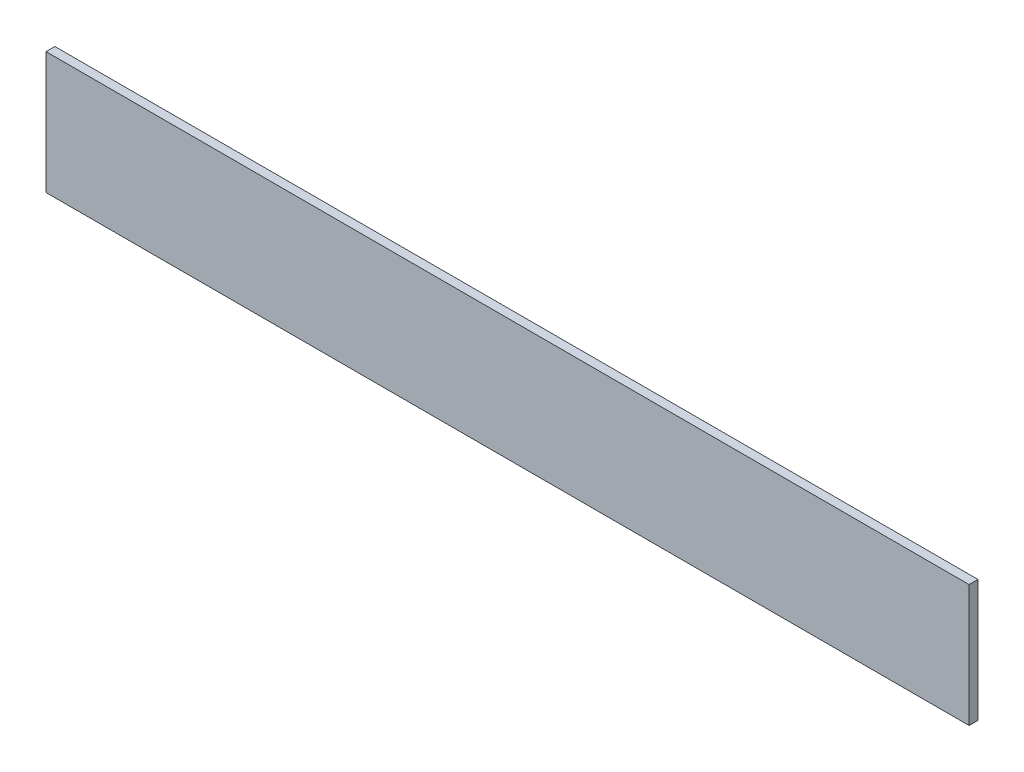
ISO-10303-21;
HEADER;
FILE_DESCRIPTION(('STEP AP214'),'2;1');
FILE_NAME('part.step','',(''),(''),'','','');
FILE_SCHEMA(('AUTOMOTIVE_DESIGN { 1 0 10303 214 1 1 1 1 }'));
ENDSEC;
DATA;
#1=APPLICATION_CONTEXT('core data for automotive mechanical design processes');
#2=APPLICATION_PROTOCOL_DEFINITION('international standard','automotive_design',2000,#1);
#3=PRODUCT_CONTEXT('',#1,'mechanical');
#4=PRODUCT('Part','Part','',(#3));
#5=PRODUCT_RELATED_PRODUCT_CATEGORY('part','',(#4));
#6=PRODUCT_DEFINITION_FORMATION('','',#4);
#7=PRODUCT_DEFINITION_CONTEXT('part definition',#1,'design');
#8=PRODUCT_DEFINITION('design','',#6,#7);
#9=PRODUCT_DEFINITION_SHAPE('','',#8);
#10=(LENGTH_UNIT() NAMED_UNIT(*) SI_UNIT(.MILLI.,.METRE.));
#11=(NAMED_UNIT(*) PLANE_ANGLE_UNIT() SI_UNIT($,.RADIAN.));
#12=(NAMED_UNIT(*) SI_UNIT($,.STERADIAN.) SOLID_ANGLE_UNIT());
#13=UNCERTAINTY_MEASURE_WITH_UNIT(LENGTH_MEASURE(1.E-05),#10,'distance_accuracy_value','');
#14=(GEOMETRIC_REPRESENTATION_CONTEXT(3) GLOBAL_UNCERTAINTY_ASSIGNED_CONTEXT((#13)) GLOBAL_UNIT_ASSIGNED_CONTEXT((#10,
#11,#12)) REPRESENTATION_CONTEXT('',''));
#15=CARTESIAN_POINT('',(0.,0.,0.));
#16=DIRECTION('',(0.,0.,1.));
#17=DIRECTION('',(1.,0.,0.));
#18=AXIS2_PLACEMENT_3D('',#15,#16,#17);
#19=CARTESIAN_POINT('',(208.,27.5,4.));
#20=DIRECTION('',(-1.,0.,0.));
#21=DIRECTION('',(0.,-1.,0.));
#22=AXIS2_PLACEMENT_3D('',#19,#20,#21);
#23=PLANE('',#22);
#24=DIRECTION('',(0.,1.,0.));
#25=VECTOR('',#24,1.);
#26=CARTESIAN_POINT('',(208.,27.5,0.));
#27=LINE('',#26,#25);
#28=CARTESIAN_POINT('',(208.,-27.5,0.));
#29=VERTEX_POINT('',#28);
#30=CARTESIAN_POINT('',(208.,27.5,0.));
#31=VERTEX_POINT('',#30);
#32=EDGE_CURVE('E98',#29,#31,#27,.T.);
#33=ORIENTED_EDGE('',*,*,#32,.T.);
#34=DIRECTION('',(0.,0.,-1.));
#35=VECTOR('',#34,1.);
#36=CARTESIAN_POINT('',(208.,27.5,4.));
#37=LINE('',#36,#35);
#38=CARTESIAN_POINT('',(208.,27.5,4.));
#39=VERTEX_POINT('',#38);
#40=EDGE_CURVE('E11',#39,#31,#37,.T.);
#41=ORIENTED_EDGE('',*,*,#40,.F.);
#42=DIRECTION('',(0.,1.,0.));
#43=VECTOR('',#42,1.);
#44=CARTESIAN_POINT('',(208.,27.5,4.));
#45=LINE('',#44,#43);
#46=CARTESIAN_POINT('',(208.,-27.5,4.));
#47=VERTEX_POINT('',#46);
#48=EDGE_CURVE('E86',#47,#39,#45,.T.);
#49=ORIENTED_EDGE('',*,*,#48,.F.);
#50=DIRECTION('',(0.,0.,-1.));
#51=VECTOR('',#50,1.);
#52=CARTESIAN_POINT('',(208.,-27.5,4.));
#53=LINE('',#52,#51);
#54=EDGE_CURVE('E94',#47,#29,#53,.T.);
#55=ORIENTED_EDGE('',*,*,#54,.T.);
#56=EDGE_LOOP('',(#33,#41,#49,#55));
#57=FACE_BOUND('',#56,.T.);
#58=ADVANCED_FACE('F35',(#57),#23,.F.);
#59=CARTESIAN_POINT('',(-208.,27.5,4.));
#60=DIRECTION('',(0.,-1.,0.));
#61=DIRECTION('',(0.,0.,-1.));
#62=AXIS2_PLACEMENT_3D('',#59,#60,#61);
#63=PLANE('',#62);
#64=DIRECTION('',(-1.,0.,0.));
#65=VECTOR('',#64,1.);
#66=CARTESIAN_POINT('',(-208.,27.5,0.));
#67=LINE('',#66,#65);
#68=CARTESIAN_POINT('',(-208.,27.5,0.));
#69=VERTEX_POINT('',#68);
#70=EDGE_CURVE('E90',#31,#69,#67,.T.);
#71=ORIENTED_EDGE('',*,*,#70,.T.);
#72=DIRECTION('',(0.,0.,-1.));
#73=VECTOR('',#72,1.);
#74=CARTESIAN_POINT('',(-208.,27.5,4.));
#75=LINE('',#74,#73);
#76=CARTESIAN_POINT('',(-208.,27.5,4.));
#77=VERTEX_POINT('',#76);
#78=EDGE_CURVE('E43',#77,#69,#75,.T.);
#79=ORIENTED_EDGE('',*,*,#78,.F.);
#80=DIRECTION('',(-1.,0.,0.));
#81=VECTOR('',#80,1.);
#82=CARTESIAN_POINT('',(-208.,27.5,4.));
#83=LINE('',#82,#81);
#84=EDGE_CURVE('E81',#39,#77,#83,.T.);
#85=ORIENTED_EDGE('',*,*,#84,.F.);
#86=ORIENTED_EDGE('',*,*,#40,.T.);
#87=EDGE_LOOP('',(#71,#79,#85,#86));
#88=FACE_BOUND('',#87,.T.);
#89=ADVANCED_FACE('F89',(#88),#63,.F.);
#90=CARTESIAN_POINT('',(-208.,27.5,4.));
#91=DIRECTION('',(1.,0.,0.));
#92=DIRECTION('',(0.,0.,-1.));
#93=AXIS2_PLACEMENT_3D('',#90,#91,#92);
#94=PLANE('',#93);
#95=DIRECTION('',(0.,-1.,0.));
#96=VECTOR('',#95,1.);
#97=CARTESIAN_POINT('',(-208.,27.5,0.));
#98=LINE('',#97,#96);
#99=CARTESIAN_POINT('',(-208.,-27.5,0.));
#100=VERTEX_POINT('',#99);
#101=EDGE_CURVE('E68',#69,#100,#98,.T.);
#102=ORIENTED_EDGE('',*,*,#101,.T.);
#103=DIRECTION('',(0.,0.,-1.));
#104=VECTOR('',#103,1.);
#105=CARTESIAN_POINT('',(-208.,-27.5,4.));
#106=LINE('',#105,#104);
#107=CARTESIAN_POINT('',(-208.,-27.5,4.));
#108=VERTEX_POINT('',#107);
#109=EDGE_CURVE('E91',#108,#100,#106,.T.);
#110=ORIENTED_EDGE('',*,*,#109,.F.);
#111=DIRECTION('',(0.,-1.,0.));
#112=VECTOR('',#111,1.);
#113=CARTESIAN_POINT('',(-208.,27.5,4.));
#114=LINE('',#113,#112);
#115=EDGE_CURVE('E84',#77,#108,#114,.T.);
#116=ORIENTED_EDGE('',*,*,#115,.F.);
#117=ORIENTED_EDGE('',*,*,#78,.T.);
#118=EDGE_LOOP('',(#102,#110,#116,#117));
#119=FACE_BOUND('',#118,.T.);
#120=ADVANCED_FACE('F92',(#119),#94,.F.);
#121=CARTESIAN_POINT('',(-208.,-27.5,4.));
#122=DIRECTION('',(0.,1.,0.));
#123=DIRECTION('',(0.,0.,1.));
#124=AXIS2_PLACEMENT_3D('',#121,#122,#123);
#125=PLANE('',#124);
#126=DIRECTION('',(1.,0.,0.));
#127=VECTOR('',#126,1.);
#128=CARTESIAN_POINT('',(-208.,-27.5,0.));
#129=LINE('',#128,#127);
#130=EDGE_CURVE('E74',#100,#29,#129,.T.);
#131=ORIENTED_EDGE('',*,*,#130,.T.);
#132=ORIENTED_EDGE('',*,*,#54,.F.);
#133=DIRECTION('',(1.,0.,0.));
#134=VECTOR('',#133,1.);
#135=CARTESIAN_POINT('',(-208.,-27.5,4.));
#136=LINE('',#135,#134);
#137=EDGE_CURVE('E51',#108,#47,#136,.T.);
#138=ORIENTED_EDGE('',*,*,#137,.F.);
#139=ORIENTED_EDGE('',*,*,#109,.T.);
#140=EDGE_LOOP('',(#131,#132,#138,#139));
#141=FACE_BOUND('',#140,.T.);
#142=ADVANCED_FACE('F105',(#141),#125,.F.);
#143=CARTESIAN_POINT('',(0.,0.,4.));
#144=DIRECTION('',(0.,0.,1.));
#145=DIRECTION('',(1.,0.,0.));
#146=AXIS2_PLACEMENT_3D('',#143,#144,#145);
#147=PLANE('',#146);
#148=ORIENTED_EDGE('',*,*,#48,.T.);
#149=ORIENTED_EDGE('',*,*,#84,.T.);
#150=ORIENTED_EDGE('',*,*,#115,.T.);
#151=ORIENTED_EDGE('',*,*,#137,.T.);
#152=EDGE_LOOP('',(#148,#149,#150,#151));
#153=FACE_BOUND('',#152,.T.);
#154=ADVANCED_FACE('F82',(#153),#147,.T.);
#155=CARTESIAN_POINT('',(0.,0.,0.));
#156=DIRECTION('',(0.,0.,1.));
#157=DIRECTION('',(1.,0.,0.));
#158=AXIS2_PLACEMENT_3D('',#155,#156,#157);
#159=PLANE('',#158);
#160=ORIENTED_EDGE('',*,*,#32,.F.);
#161=ORIENTED_EDGE('',*,*,#130,.F.);
#162=ORIENTED_EDGE('',*,*,#101,.F.);
#163=ORIENTED_EDGE('',*,*,#70,.F.);
#164=EDGE_LOOP('',(#160,#161,#162,#163));
#165=FACE_BOUND('',#164,.T.);
#166=ADVANCED_FACE('F108',(#165),#159,.F.);
#167=CLOSED_SHELL('',(#58,#89,#120,#142,#154,#166));
#168=MANIFOLD_SOLID_BREP('B2',#167);
#169=ADVANCED_BREP_SHAPE_REPRESENTATION('',(#18,#168),#14);
#170=SHAPE_DEFINITION_REPRESENTATION(#9,#169);
ENDSEC;
END-ISO-10303-21;
